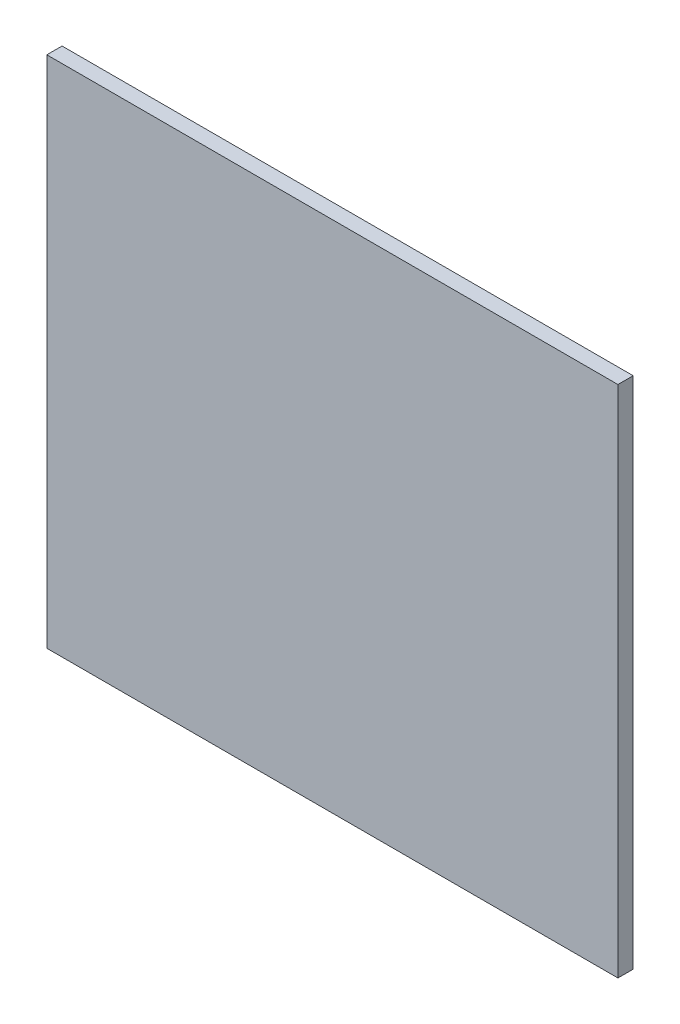
ISO-10303-21;
HEADER;
FILE_DESCRIPTION(('STEP AP214'),'2;1');
FILE_NAME('part.step','',(''),(''),'','','');
FILE_SCHEMA(('AUTOMOTIVE_DESIGN { 1 0 10303 214 1 1 1 1 }'));
ENDSEC;
DATA;
#1=APPLICATION_CONTEXT('core data for automotive mechanical design processes');
#2=APPLICATION_PROTOCOL_DEFINITION('international standard','automotive_design',2000,#1);
#3=PRODUCT_CONTEXT('',#1,'mechanical');
#4=PRODUCT('Part','Part','',(#3));
#5=PRODUCT_RELATED_PRODUCT_CATEGORY('part','',(#4));
#6=PRODUCT_DEFINITION_FORMATION('','',#4);
#7=PRODUCT_DEFINITION_CONTEXT('part definition',#1,'design');
#8=PRODUCT_DEFINITION('design','',#6,#7);
#9=PRODUCT_DEFINITION_SHAPE('','',#8);
#10=(LENGTH_UNIT() NAMED_UNIT(*) SI_UNIT(.MILLI.,.METRE.));
#11=(NAMED_UNIT(*) PLANE_ANGLE_UNIT() SI_UNIT($,.RADIAN.));
#12=(NAMED_UNIT(*) SI_UNIT($,.STERADIAN.) SOLID_ANGLE_UNIT());
#13=UNCERTAINTY_MEASURE_WITH_UNIT(LENGTH_MEASURE(1.E-05),#10,'distance_accuracy_value','');
#14=(GEOMETRIC_REPRESENTATION_CONTEXT(3) GLOBAL_UNCERTAINTY_ASSIGNED_CONTEXT((#13)) GLOBAL_UNIT_ASSIGNED_CONTEXT((#10,
#11,#12)) REPRESENTATION_CONTEXT('',''));
#15=CARTESIAN_POINT('',(0.,0.,0.));
#16=DIRECTION('',(0.,0.,1.));
#17=DIRECTION('',(1.,0.,0.));
#18=AXIS2_PLACEMENT_3D('',#15,#16,#17);
#19=CARTESIAN_POINT('',(0.,0.,8.));
#20=DIRECTION('',(1.,0.,0.));
#21=DIRECTION('',(0.,0.,-1.));
#22=AXIS2_PLACEMENT_3D('',#19,#20,#21);
#23=PLANE('',#22);
#24=DIRECTION('',(0.,-1.,0.));
#25=VECTOR('',#24,1.);
#26=CARTESIAN_POINT('',(0.,0.,0.));
#27=LINE('',#26,#25);
#28=CARTESIAN_POINT('',(0.,270.,0.));
#29=VERTEX_POINT('',#28);
#30=CARTESIAN_POINT('',(0.,0.,0.));
#31=VERTEX_POINT('',#30);
#32=EDGE_CURVE('E96',#29,#31,#27,.T.);
#33=ORIENTED_EDGE('',*,*,#32,.T.);
#34=DIRECTION('',(0.,0.,-1.));
#35=VECTOR('',#34,1.);
#36=CARTESIAN_POINT('',(0.,0.,8.));
#37=LINE('',#36,#35);
#38=CARTESIAN_POINT('',(0.,0.,8.));
#39=VERTEX_POINT('',#38);
#40=EDGE_CURVE('E11',#39,#31,#37,.T.);
#41=ORIENTED_EDGE('',*,*,#40,.F.);
#42=DIRECTION('',(0.,-1.,0.));
#43=VECTOR('',#42,1.);
#44=CARTESIAN_POINT('',(0.,0.,8.));
#45=LINE('',#44,#43);
#46=CARTESIAN_POINT('',(0.,270.,8.));
#47=VERTEX_POINT('',#46);
#48=EDGE_CURVE('E84',#47,#39,#45,.T.);
#49=ORIENTED_EDGE('',*,*,#48,.F.);
#50=DIRECTION('',(0.,0.,-1.));
#51=VECTOR('',#50,1.);
#52=CARTESIAN_POINT('',(0.,270.,8.));
#53=LINE('',#52,#51);
#54=EDGE_CURVE('E92',#47,#29,#53,.T.);
#55=ORIENTED_EDGE('',*,*,#54,.T.);
#56=EDGE_LOOP('',(#33,#41,#49,#55));
#57=FACE_BOUND('',#56,.T.);
#58=ADVANCED_FACE('F33',(#57),#23,.F.);
#59=CARTESIAN_POINT('',(0.,0.,8.));
#60=DIRECTION('',(0.,1.,0.));
#61=DIRECTION('',(0.,0.,1.));
#62=AXIS2_PLACEMENT_3D('',#59,#60,#61);
#63=PLANE('',#62);
#64=DIRECTION('',(1.,0.,0.));
#65=VECTOR('',#64,1.);
#66=CARTESIAN_POINT('',(0.,0.,0.));
#67=LINE('',#66,#65);
#68=CARTESIAN_POINT('',(300.,0.,0.));
#69=VERTEX_POINT('',#68);
#70=EDGE_CURVE('E88',#31,#69,#67,.T.);
#71=ORIENTED_EDGE('',*,*,#70,.T.);
#72=DIRECTION('',(0.,0.,-1.));
#73=VECTOR('',#72,1.);
#74=CARTESIAN_POINT('',(300.,0.,8.));
#75=LINE('',#74,#73);
#76=CARTESIAN_POINT('',(300.,0.,8.));
#77=VERTEX_POINT('',#76);
#78=EDGE_CURVE('E41',#77,#69,#75,.T.);
#79=ORIENTED_EDGE('',*,*,#78,.F.);
#80=DIRECTION('',(1.,0.,0.));
#81=VECTOR('',#80,1.);
#82=CARTESIAN_POINT('',(0.,0.,8.));
#83=LINE('',#82,#81);
#84=EDGE_CURVE('E79',#39,#77,#83,.T.);
#85=ORIENTED_EDGE('',*,*,#84,.F.);
#86=ORIENTED_EDGE('',*,*,#40,.T.);
#87=EDGE_LOOP('',(#71,#79,#85,#86));
#88=FACE_BOUND('',#87,.T.);
#89=ADVANCED_FACE('F87',(#88),#63,.F.);
#90=CARTESIAN_POINT('',(300.,0.,8.));
#91=DIRECTION('',(-1.,0.,0.));
#92=DIRECTION('',(0.,0.,1.));
#93=AXIS2_PLACEMENT_3D('',#90,#91,#92);
#94=PLANE('',#93);
#95=DIRECTION('',(0.,1.,0.));
#96=VECTOR('',#95,1.);
#97=CARTESIAN_POINT('',(300.,0.,0.));
#98=LINE('',#97,#96);
#99=CARTESIAN_POINT('',(300.,270.,0.));
#100=VERTEX_POINT('',#99);
#101=EDGE_CURVE('E66',#69,#100,#98,.T.);
#102=ORIENTED_EDGE('',*,*,#101,.T.);
#103=DIRECTION('',(0.,0.,-1.));
#104=VECTOR('',#103,1.);
#105=CARTESIAN_POINT('',(300.,270.,8.));
#106=LINE('',#105,#104);
#107=CARTESIAN_POINT('',(300.,270.,8.));
#108=VERTEX_POINT('',#107);
#109=EDGE_CURVE('E89',#108,#100,#106,.T.);
#110=ORIENTED_EDGE('',*,*,#109,.F.);
#111=DIRECTION('',(0.,1.,0.));
#112=VECTOR('',#111,1.);
#113=CARTESIAN_POINT('',(300.,0.,8.));
#114=LINE('',#113,#112);
#115=EDGE_CURVE('E82',#77,#108,#114,.T.);
#116=ORIENTED_EDGE('',*,*,#115,.F.);
#117=ORIENTED_EDGE('',*,*,#78,.T.);
#118=EDGE_LOOP('',(#102,#110,#116,#117));
#119=FACE_BOUND('',#118,.T.);
#120=ADVANCED_FACE('F90',(#119),#94,.F.);
#121=CARTESIAN_POINT('',(0.,270.,8.));
#122=DIRECTION('',(0.,-1.,0.));
#123=DIRECTION('',(0.,0.,-1.));
#124=AXIS2_PLACEMENT_3D('',#121,#122,#123);
#125=PLANE('',#124);
#126=DIRECTION('',(-1.,0.,0.));
#127=VECTOR('',#126,1.);
#128=CARTESIAN_POINT('',(0.,270.,0.));
#129=LINE('',#128,#127);
#130=EDGE_CURVE('E72',#100,#29,#129,.T.);
#131=ORIENTED_EDGE('',*,*,#130,.T.);
#132=ORIENTED_EDGE('',*,*,#54,.F.);
#133=DIRECTION('',(-1.,0.,0.));
#134=VECTOR('',#133,1.);
#135=CARTESIAN_POINT('',(0.,270.,8.));
#136=LINE('',#135,#134);
#137=EDGE_CURVE('E49',#108,#47,#136,.T.);
#138=ORIENTED_EDGE('',*,*,#137,.F.);
#139=ORIENTED_EDGE('',*,*,#109,.T.);
#140=EDGE_LOOP('',(#131,#132,#138,#139));
#141=FACE_BOUND('',#140,.T.);
#142=ADVANCED_FACE('F103',(#141),#125,.F.);
#143=CARTESIAN_POINT('',(0.,0.,8.));
#144=DIRECTION('',(0.,0.,-1.));
#145=DIRECTION('',(-1.,0.,0.));
#146=AXIS2_PLACEMENT_3D('',#143,#144,#145);
#147=PLANE('',#146);
#148=ORIENTED_EDGE('',*,*,#48,.T.);
#149=ORIENTED_EDGE('',*,*,#84,.T.);
#150=ORIENTED_EDGE('',*,*,#115,.T.);
#151=ORIENTED_EDGE('',*,*,#137,.T.);
#152=EDGE_LOOP('',(#148,#149,#150,#151));
#153=FACE_BOUND('',#152,.T.);
#154=ADVANCED_FACE('F80',(#153),#147,.F.);
#155=CARTESIAN_POINT('',(0.,0.,0.));
#156=DIRECTION('',(0.,0.,-1.));
#157=DIRECTION('',(-1.,0.,0.));
#158=AXIS2_PLACEMENT_3D('',#155,#156,#157);
#159=PLANE('',#158);
#160=ORIENTED_EDGE('',*,*,#32,.F.);
#161=ORIENTED_EDGE('',*,*,#130,.F.);
#162=ORIENTED_EDGE('',*,*,#101,.F.);
#163=ORIENTED_EDGE('',*,*,#70,.F.);
#164=EDGE_LOOP('',(#160,#161,#162,#163));
#165=FACE_BOUND('',#164,.T.);
#166=ADVANCED_FACE('F106',(#165),#159,.T.);
#167=CLOSED_SHELL('',(#58,#89,#120,#142,#154,#166));
#168=MANIFOLD_SOLID_BREP('B2',#167);
#169=ADVANCED_BREP_SHAPE_REPRESENTATION('',(#18,#168),#14);
#170=SHAPE_DEFINITION_REPRESENTATION(#9,#169);
ENDSEC;
END-ISO-10303-21;
